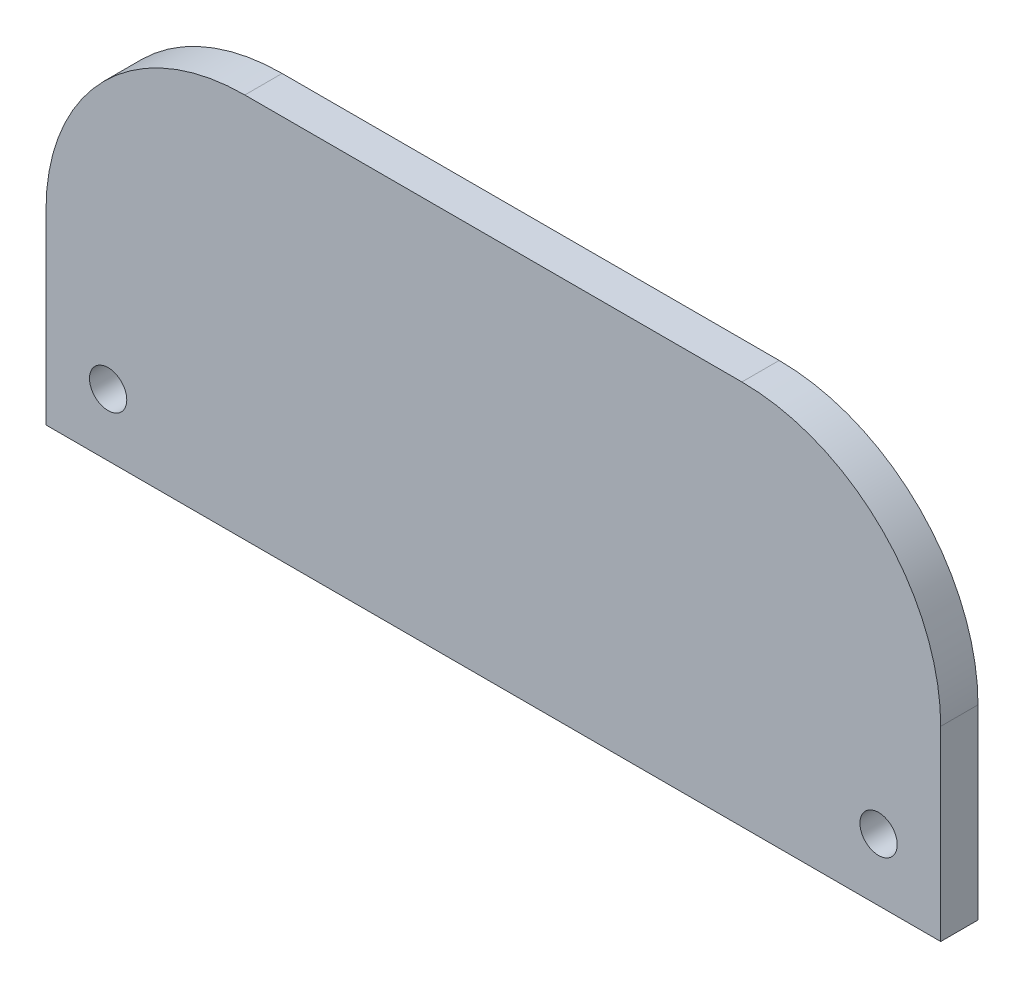
ISO-10303-21;
HEADER;
FILE_DESCRIPTION(('STEP AP214'),'2;1');
FILE_NAME('part.step','',(''),(''),'','','');
FILE_SCHEMA(('AUTOMOTIVE_DESIGN { 1 0 10303 214 1 1 1 1 }'));
ENDSEC;
DATA;
#1=APPLICATION_CONTEXT('core data for automotive mechanical design processes');
#2=APPLICATION_PROTOCOL_DEFINITION('international standard','automotive_design',2000,#1);
#3=PRODUCT_CONTEXT('',#1,'mechanical');
#4=PRODUCT('Part','Part','',(#3));
#5=PRODUCT_RELATED_PRODUCT_CATEGORY('part','',(#4));
#6=PRODUCT_DEFINITION_FORMATION('','',#4);
#7=PRODUCT_DEFINITION_CONTEXT('part definition',#1,'design');
#8=PRODUCT_DEFINITION('design','',#6,#7);
#9=PRODUCT_DEFINITION_SHAPE('','',#8);
#10=(LENGTH_UNIT() NAMED_UNIT(*) SI_UNIT(.MILLI.,.METRE.));
#11=(NAMED_UNIT(*) PLANE_ANGLE_UNIT() SI_UNIT($,.RADIAN.));
#12=(NAMED_UNIT(*) SI_UNIT($,.STERADIAN.) SOLID_ANGLE_UNIT());
#13=UNCERTAINTY_MEASURE_WITH_UNIT(LENGTH_MEASURE(1.E-05),#10,'distance_accuracy_value','');
#14=(GEOMETRIC_REPRESENTATION_CONTEXT(3) GLOBAL_UNCERTAINTY_ASSIGNED_CONTEXT((#13)) GLOBAL_UNIT_ASSIGNED_CONTEXT((#10,
#11,#12)) REPRESENTATION_CONTEXT('',''));
#15=CARTESIAN_POINT('',(0.,0.,0.));
#16=DIRECTION('',(0.,0.,1.));
#17=DIRECTION('',(1.,0.,0.));
#18=AXIS2_PLACEMENT_3D('',#15,#16,#17);
#19=CARTESIAN_POINT('',(66.,5.,53.));
#20=DIRECTION('',(0.,0.,-1.));
#21=DIRECTION('',(-1.,0.,0.));
#22=AXIS2_PLACEMENT_3D('',#19,#20,#21);
#23=CYLINDRICAL_SURFACE('',#22,1.5);
#24=CARTESIAN_POINT('',(66.,5.,10.));
#25=DIRECTION('',(0.,0.,1.));
#26=DIRECTION('',(1.,0.,0.));
#27=AXIS2_PLACEMENT_3D('',#24,#25,#26);
#28=CIRCLE('',#27,1.5);
#29=CARTESIAN_POINT('',(67.5,5.,10.));
#30=VERTEX_POINT('',#29);
#31=EDGE_CURVE('E98',#30,#30,#28,.F.);
#32=ORIENTED_EDGE('',*,*,#31,.T.);
#33=EDGE_LOOP('',(#32));
#34=FACE_BOUND('',#33,.T.);
#35=CARTESIAN_POINT('',(66.,5.,13.));
#36=DIRECTION('',(0.,0.,1.));
#37=DIRECTION('',(1.,0.,0.));
#38=AXIS2_PLACEMENT_3D('',#35,#36,#37);
#39=CIRCLE('',#38,1.5);
#40=CARTESIAN_POINT('',(67.5,5.,13.));
#41=VERTEX_POINT('',#40);
#42=EDGE_CURVE('E147',#41,#41,#39,.F.);
#43=ORIENTED_EDGE('',*,*,#42,.F.);
#44=EDGE_LOOP('',(#43));
#45=FACE_BOUND('',#44,.T.);
#46=ADVANCED_FACE('F36',(#34,#45),#23,.F.);
#47=CARTESIAN_POINT('',(4.,5.,53.));
#48=DIRECTION('',(0.,0.,-1.));
#49=DIRECTION('',(-1.,0.,0.));
#50=AXIS2_PLACEMENT_3D('',#47,#48,#49);
#51=CYLINDRICAL_SURFACE('',#50,1.5);
#52=CARTESIAN_POINT('',(4.,5.,10.));
#53=DIRECTION('',(0.,0.,1.));
#54=DIRECTION('',(1.,0.,0.));
#55=AXIS2_PLACEMENT_3D('',#52,#53,#54);
#56=CIRCLE('',#55,1.5);
#57=CARTESIAN_POINT('',(5.5,5.,10.));
#58=VERTEX_POINT('',#57);
#59=EDGE_CURVE('E155',#58,#58,#56,.F.);
#60=ORIENTED_EDGE('',*,*,#59,.T.);
#61=EDGE_LOOP('',(#60));
#62=FACE_BOUND('',#61,.T.);
#63=CARTESIAN_POINT('',(4.,5.,13.));
#64=DIRECTION('',(0.,0.,1.));
#65=DIRECTION('',(1.,0.,0.));
#66=AXIS2_PLACEMENT_3D('',#63,#64,#65);
#67=CIRCLE('',#66,1.5);
#68=CARTESIAN_POINT('',(5.5,5.,13.));
#69=VERTEX_POINT('',#68);
#70=EDGE_CURVE('E130',#69,#69,#67,.F.);
#71=ORIENTED_EDGE('',*,*,#70,.F.);
#72=EDGE_LOOP('',(#71));
#73=FACE_BOUND('',#72,.T.);
#74=ADVANCED_FACE('F160',(#62,#73),#51,.F.);
#75=CARTESIAN_POINT('',(0.,0.,13.));
#76=DIRECTION('',(0.,0.,1.));
#77=DIRECTION('',(1.,0.,0.));
#78=AXIS2_PLACEMENT_3D('',#75,#76,#77);
#79=PLANE('',#78);
#80=ORIENTED_EDGE('',*,*,#70,.T.);
#81=EDGE_LOOP('',(#80));
#82=FACE_BOUND('',#81,.T.);
#83=ORIENTED_EDGE('',*,*,#42,.T.);
#84=EDGE_LOOP('',(#83));
#85=FACE_BOUND('',#84,.T.);
#86=DIRECTION('',(1.,0.,0.));
#87=VECTOR('',#86,1.);
#88=CARTESIAN_POINT('',(0.,31.,13.));
#89=LINE('',#88,#87);
#90=CARTESIAN_POINT('',(15.,31.,13.));
#91=VERTEX_POINT('',#90);
#92=CARTESIAN_POINT('',(55.,31.,13.));
#93=VERTEX_POINT('',#92);
#94=EDGE_CURVE('E118',#91,#93,#89,.T.);
#95=ORIENTED_EDGE('',*,*,#94,.F.);
#96=CARTESIAN_POINT('',(15.,15.,13.));
#97=DIRECTION('',(0.,0.,1.));
#98=DIRECTION('',(1.,0.,0.));
#99=AXIS2_PLACEMENT_3D('',#96,#97,#98);
#100=CIRCLE('',#99,16.);
#101=CARTESIAN_POINT('',(-1.,15.,13.));
#102=VERTEX_POINT('',#101);
#103=EDGE_CURVE('E116',#91,#102,#100,.T.);
#104=ORIENTED_EDGE('',*,*,#103,.T.);
#105=DIRECTION('',(0.,-1.,0.));
#106=VECTOR('',#105,1.);
#107=CARTESIAN_POINT('',(-1.,0.,13.));
#108=LINE('',#107,#106);
#109=CARTESIAN_POINT('',(-1.,0.,13.));
#110=VERTEX_POINT('',#109);
#111=EDGE_CURVE('E111',#102,#110,#108,.T.);
#112=ORIENTED_EDGE('',*,*,#111,.T.);
#113=DIRECTION('',(1.,0.,0.));
#114=VECTOR('',#113,1.);
#115=CARTESIAN_POINT('',(0.,0.,13.));
#116=LINE('',#115,#114);
#117=CARTESIAN_POINT('',(71.,0.,13.));
#118=VERTEX_POINT('',#117);
#119=EDGE_CURVE('E107',#110,#118,#116,.T.);
#120=ORIENTED_EDGE('',*,*,#119,.T.);
#121=DIRECTION('',(0.,1.,0.));
#122=VECTOR('',#121,1.);
#123=CARTESIAN_POINT('',(71.,0.,13.));
#124=LINE('',#123,#122);
#125=CARTESIAN_POINT('',(71.,15.,13.));
#126=VERTEX_POINT('',#125);
#127=EDGE_CURVE('E110',#118,#126,#124,.T.);
#128=ORIENTED_EDGE('',*,*,#127,.T.);
#129=CARTESIAN_POINT('',(55.,15.,13.));
#130=DIRECTION('',(0.,0.,1.));
#131=DIRECTION('',(1.,0.,0.));
#132=AXIS2_PLACEMENT_3D('',#129,#130,#131);
#133=CIRCLE('',#132,16.);
#134=EDGE_CURVE('E59',#126,#93,#133,.T.);
#135=ORIENTED_EDGE('',*,*,#134,.T.);
#136=EDGE_LOOP('',(#95,#104,#112,#120,#128,#135));
#137=FACE_BOUND('',#136,.T.);
#138=ADVANCED_FACE('F114',(#82,#85,#137),#79,.T.);
#139=CARTESIAN_POINT('',(0.,31.,13.));
#140=DIRECTION('',(0.,1.,0.));
#141=DIRECTION('',(-1.,0.,0.));
#142=AXIS2_PLACEMENT_3D('',#139,#140,#141);
#143=PLANE('',#142);
#144=DIRECTION('',(1.,0.,0.));
#145=VECTOR('',#144,1.);
#146=CARTESIAN_POINT('',(0.,31.,10.));
#147=LINE('',#146,#145);
#148=CARTESIAN_POINT('',(15.,31.,10.));
#149=VERTEX_POINT('',#148);
#150=CARTESIAN_POINT('',(55.,31.,10.));
#151=VERTEX_POINT('',#150);
#152=EDGE_CURVE('E97',#149,#151,#147,.T.);
#153=ORIENTED_EDGE('',*,*,#152,.F.);
#154=DIRECTION('',(0.,0.,-1.));
#155=VECTOR('',#154,1.);
#156=CARTESIAN_POINT('',(15.,31.,13.));
#157=LINE('',#156,#155);
#158=EDGE_CURVE('E137',#91,#149,#157,.T.);
#159=ORIENTED_EDGE('',*,*,#158,.F.);
#160=ORIENTED_EDGE('',*,*,#94,.T.);
#161=DIRECTION('',(0.,0.,-1.));
#162=VECTOR('',#161,1.);
#163=CARTESIAN_POINT('',(55.,31.,13.));
#164=LINE('',#163,#162);
#165=EDGE_CURVE('E124',#93,#151,#164,.T.);
#166=ORIENTED_EDGE('',*,*,#165,.T.);
#167=EDGE_LOOP('',(#153,#159,#160,#166));
#168=FACE_BOUND('',#167,.T.);
#169=ADVANCED_FACE('F146',(#168),#143,.T.);
#170=CARTESIAN_POINT('',(15.,15.,13.));
#171=DIRECTION('',(0.,0.,-1.));
#172=DIRECTION('',(-1.,0.,0.));
#173=AXIS2_PLACEMENT_3D('',#170,#171,#172);
#174=CYLINDRICAL_SURFACE('',#173,16.);
#175=CARTESIAN_POINT('',(15.,15.,10.));
#176=DIRECTION('',(0.,0.,1.));
#177=DIRECTION('',(1.,0.,0.));
#178=AXIS2_PLACEMENT_3D('',#175,#176,#177);
#179=CIRCLE('',#178,16.);
#180=CARTESIAN_POINT('',(-1.,15.,10.));
#181=VERTEX_POINT('',#180);
#182=EDGE_CURVE('E51',#149,#181,#179,.T.);
#183=ORIENTED_EDGE('',*,*,#182,.T.);
#184=DIRECTION('',(0.,0.,-1.));
#185=VECTOR('',#184,1.);
#186=CARTESIAN_POINT('',(-1.,15.,13.));
#187=LINE('',#186,#185);
#188=EDGE_CURVE('E104',#102,#181,#187,.T.);
#189=ORIENTED_EDGE('',*,*,#188,.F.);
#190=ORIENTED_EDGE('',*,*,#103,.F.);
#191=ORIENTED_EDGE('',*,*,#158,.T.);
#192=EDGE_LOOP('',(#183,#189,#190,#191));
#193=FACE_BOUND('',#192,.T.);
#194=ADVANCED_FACE('F180',(#193),#174,.T.);
#195=CARTESIAN_POINT('',(55.,15.,13.));
#196=DIRECTION('',(0.,0.,-1.));
#197=DIRECTION('',(-1.,0.,0.));
#198=AXIS2_PLACEMENT_3D('',#195,#196,#197);
#199=CYLINDRICAL_SURFACE('',#198,16.);
#200=CARTESIAN_POINT('',(55.,15.,10.));
#201=DIRECTION('',(0.,0.,1.));
#202=DIRECTION('',(1.,0.,0.));
#203=AXIS2_PLACEMENT_3D('',#200,#201,#202);
#204=CIRCLE('',#203,16.);
#205=CARTESIAN_POINT('',(71.,15.,10.));
#206=VERTEX_POINT('',#205);
#207=EDGE_CURVE('E127',#206,#151,#204,.T.);
#208=ORIENTED_EDGE('',*,*,#207,.T.);
#209=ORIENTED_EDGE('',*,*,#165,.F.);
#210=ORIENTED_EDGE('',*,*,#134,.F.);
#211=DIRECTION('',(0.,0.,-1.));
#212=VECTOR('',#211,1.);
#213=CARTESIAN_POINT('',(71.,15.,13.));
#214=LINE('',#213,#212);
#215=EDGE_CURVE('E133',#126,#206,#214,.T.);
#216=ORIENTED_EDGE('',*,*,#215,.T.);
#217=EDGE_LOOP('',(#208,#209,#210,#216));
#218=FACE_BOUND('',#217,.T.);
#219=ADVANCED_FACE('F142',(#218),#199,.T.);
#220=CARTESIAN_POINT('',(71.,15.,5.));
#221=DIRECTION('',(1.,0.,0.));
#222=DIRECTION('',(0.,0.,-1.));
#223=AXIS2_PLACEMENT_3D('',#220,#221,#222);
#224=PLANE('',#223);
#225=DIRECTION('',(0.,1.,0.));
#226=VECTOR('',#225,1.);
#227=CARTESIAN_POINT('',(71.,-7.00000000000002,10.));
#228=LINE('',#227,#226);
#229=CARTESIAN_POINT('',(71.,0.,10.));
#230=VERTEX_POINT('',#229);
#231=EDGE_CURVE('E94',#230,#206,#228,.T.);
#232=ORIENTED_EDGE('',*,*,#231,.T.);
#233=ORIENTED_EDGE('',*,*,#215,.F.);
#234=ORIENTED_EDGE('',*,*,#127,.F.);
#235=DIRECTION('',(0.,0.,-1.));
#236=VECTOR('',#235,1.);
#237=CARTESIAN_POINT('',(71.,0.,5.));
#238=LINE('',#237,#236);
#239=EDGE_CURVE('E44',#118,#230,#238,.T.);
#240=ORIENTED_EDGE('',*,*,#239,.T.);
#241=EDGE_LOOP('',(#232,#233,#234,#240));
#242=FACE_BOUND('',#241,.T.);
#243=ADVANCED_FACE('F139',(#242),#224,.T.);
#244=CARTESIAN_POINT('',(-1.,15.,5.));
#245=DIRECTION('',(1.,0.,0.));
#246=DIRECTION('',(0.,0.,-1.));
#247=AXIS2_PLACEMENT_3D('',#244,#245,#246);
#248=PLANE('',#247);
#249=ORIENTED_EDGE('',*,*,#188,.T.);
#250=DIRECTION('',(0.,1.,0.));
#251=VECTOR('',#250,1.);
#252=CARTESIAN_POINT('',(-1.,-7.00000000000002,10.));
#253=LINE('',#252,#251);
#254=CARTESIAN_POINT('',(-1.,0.,10.));
#255=VERTEX_POINT('',#254);
#256=EDGE_CURVE('E91',#255,#181,#253,.T.);
#257=ORIENTED_EDGE('',*,*,#256,.F.);
#258=DIRECTION('',(0.,0.,-1.));
#259=VECTOR('',#258,1.);
#260=CARTESIAN_POINT('',(-1.,0.,5.));
#261=LINE('',#260,#259);
#262=EDGE_CURVE('E11',#110,#255,#261,.T.);
#263=ORIENTED_EDGE('',*,*,#262,.F.);
#264=ORIENTED_EDGE('',*,*,#111,.F.);
#265=EDGE_LOOP('',(#249,#257,#263,#264));
#266=FACE_BOUND('',#265,.T.);
#267=ADVANCED_FACE('F101',(#266),#248,.F.);
#268=CARTESIAN_POINT('',(0.,0.,10.));
#269=DIRECTION('',(0.,1.,0.));
#270=DIRECTION('',(0.,0.,1.));
#271=AXIS2_PLACEMENT_3D('',#268,#269,#270);
#272=PLANE('',#271);
#273=ORIENTED_EDGE('',*,*,#262,.T.);
#274=DIRECTION('',(1.,0.,0.));
#275=VECTOR('',#274,1.);
#276=CARTESIAN_POINT('',(0.,0.,10.));
#277=LINE('',#276,#275);
#278=EDGE_CURVE('E88',#255,#230,#277,.T.);
#279=ORIENTED_EDGE('',*,*,#278,.T.);
#280=ORIENTED_EDGE('',*,*,#239,.F.);
#281=ORIENTED_EDGE('',*,*,#119,.F.);
#282=EDGE_LOOP('',(#273,#279,#280,#281));
#283=FACE_BOUND('',#282,.T.);
#284=ADVANCED_FACE('F38',(#283),#272,.F.);
#285=CARTESIAN_POINT('',(0.,0.,10.));
#286=DIRECTION('',(0.,0.,1.));
#287=DIRECTION('',(1.,0.,0.));
#288=AXIS2_PLACEMENT_3D('',#285,#286,#287);
#289=PLANE('',#288);
#290=ORIENTED_EDGE('',*,*,#59,.F.);
#291=EDGE_LOOP('',(#290));
#292=FACE_BOUND('',#291,.T.);
#293=ORIENTED_EDGE('',*,*,#31,.F.);
#294=EDGE_LOOP('',(#293));
#295=FACE_BOUND('',#294,.T.);
#296=ORIENTED_EDGE('',*,*,#256,.T.);
#297=ORIENTED_EDGE('',*,*,#182,.F.);
#298=ORIENTED_EDGE('',*,*,#152,.T.);
#299=ORIENTED_EDGE('',*,*,#207,.F.);
#300=ORIENTED_EDGE('',*,*,#231,.F.);
#301=ORIENTED_EDGE('',*,*,#278,.F.);
#302=EDGE_LOOP('',(#296,#297,#298,#299,#300,#301));
#303=FACE_BOUND('',#302,.T.);
#304=ADVANCED_FACE('F90',(#292,#295,#303),#289,.F.);
#305=CLOSED_SHELL('',(#46,#74,#138,#169,#194,#219,#243,#267,#284,#304));
#306=MANIFOLD_SOLID_BREP('B2',#305);
#307=ADVANCED_BREP_SHAPE_REPRESENTATION('',(#18,#306),#14);
#308=SHAPE_DEFINITION_REPRESENTATION(#9,#307);
ENDSEC;
END-ISO-10303-21;
